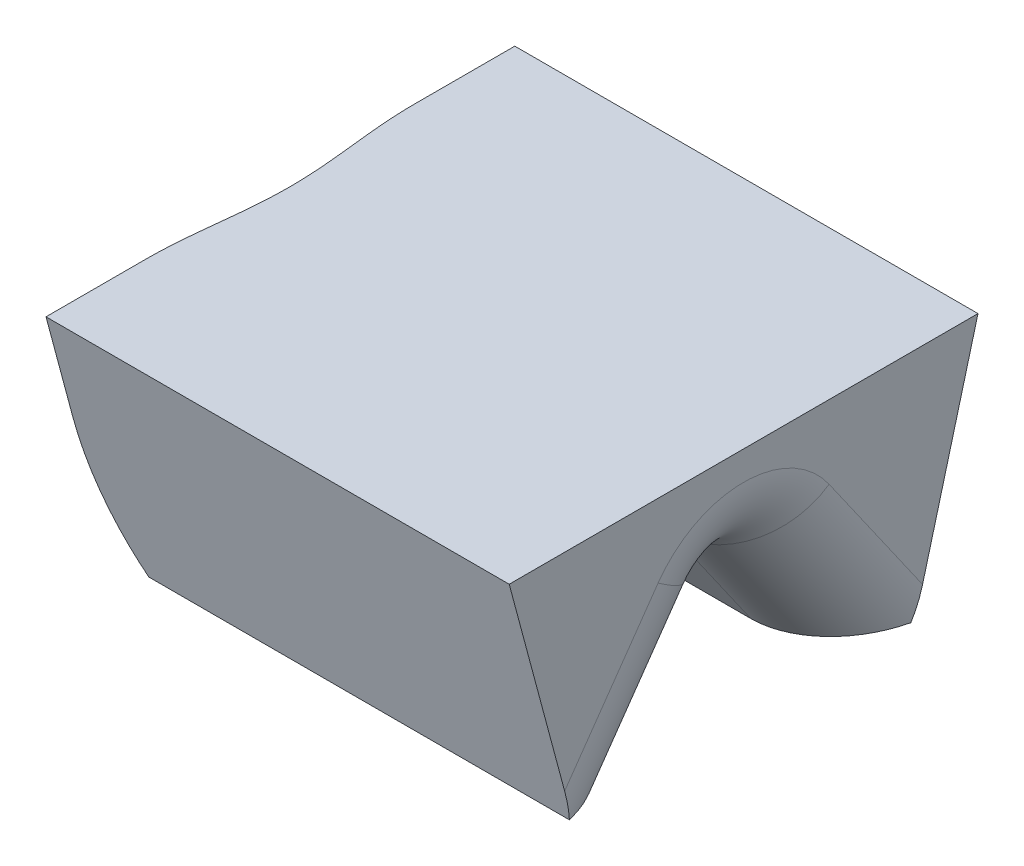
ISO-10303-21;
HEADER;
FILE_DESCRIPTION(('STEP AP214'),'2;1');
FILE_NAME('part.step','',(''),(''),'','','');
FILE_SCHEMA(('AUTOMOTIVE_DESIGN { 1 0 10303 214 1 1 1 1 }'));
ENDSEC;
DATA;
#1=APPLICATION_CONTEXT('core data for automotive mechanical design processes');
#2=APPLICATION_PROTOCOL_DEFINITION('international standard','automotive_design',2000,#1);
#3=PRODUCT_CONTEXT('',#1,'mechanical');
#4=PRODUCT('Part','Part','',(#3));
#5=PRODUCT_RELATED_PRODUCT_CATEGORY('part','',(#4));
#6=PRODUCT_DEFINITION_FORMATION('','',#4);
#7=PRODUCT_DEFINITION_CONTEXT('part definition',#1,'design');
#8=PRODUCT_DEFINITION('design','',#6,#7);
#9=PRODUCT_DEFINITION_SHAPE('','',#8);
#10=(LENGTH_UNIT() NAMED_UNIT(*) SI_UNIT(.MILLI.,.METRE.));
#11=(NAMED_UNIT(*) PLANE_ANGLE_UNIT() SI_UNIT($,.RADIAN.));
#12=(NAMED_UNIT(*) SI_UNIT($,.STERADIAN.) SOLID_ANGLE_UNIT());
#13=UNCERTAINTY_MEASURE_WITH_UNIT(LENGTH_MEASURE(1.E-05),#10,'distance_accuracy_value','');
#14=(GEOMETRIC_REPRESENTATION_CONTEXT(3) GLOBAL_UNCERTAINTY_ASSIGNED_CONTEXT((#13)) GLOBAL_UNIT_ASSIGNED_CONTEXT((#10,
#11,#12)) REPRESENTATION_CONTEXT('',''));
#15=CARTESIAN_POINT('',(0.,0.,0.));
#16=DIRECTION('',(0.,0.,1.));
#17=DIRECTION('',(1.,0.,0.));
#18=AXIS2_PLACEMENT_3D('',#15,#16,#17);
#19=CARTESIAN_POINT('',(0.,0.277595628415304,0.));
#20=DIRECTION('',(0.,1.,0.));
#21=DIRECTION('',(0.,0.,1.));
#22=AXIS2_PLACEMENT_3D('',#19,#20,#21);
#23=PLANE('',#22);
#24=DIRECTION('',(0.,0.,1.));
#25=VECTOR('',#24,1.);
#26=CARTESIAN_POINT('',(0.27178,0.277595628415304,1.50859998));
#27=LINE('',#26,#25);
#28=CARTESIAN_POINT('',(0.27178,0.277595628415304,-0.273771524456291));
#29=VERTEX_POINT('',#28);
#30=CARTESIAN_POINT('',(0.27178,0.277595628415304,0.273771524456291));
#31=VERTEX_POINT('',#30);
#32=EDGE_CURVE('E374',#29,#31,#27,.T.);
#33=ORIENTED_EDGE('',*,*,#32,.F.);
#34=DIRECTION('',(1.,0.,0.));
#35=VECTOR('',#34,1.);
#36=CARTESIAN_POINT('',(1.50859998,0.277595628415304,-0.273771524456291));
#37=LINE('',#36,#35);
#38=CARTESIAN_POINT('',(-0.26924,0.277595628415304,-0.273771524456291));
#39=VERTEX_POINT('',#38);
#40=EDGE_CURVE('E392',#39,#29,#37,.T.);
#41=ORIENTED_EDGE('',*,*,#40,.F.);
#42=DIRECTION('',(0.,0.,-1.));
#43=VECTOR('',#42,1.);
#44=CARTESIAN_POINT('',(-0.26924,0.277595628415304,1.50859998));
#45=LINE('',#44,#43);
#46=CARTESIAN_POINT('',(-0.26924,0.277595628415304,-0.156835133555911));
#47=VERTEX_POINT('',#46);
#48=EDGE_CURVE('E63',#47,#39,#45,.T.);
#49=ORIENTED_EDGE('',*,*,#48,.F.);
#50=CARTESIAN_POINT('',(-0.258316065764862,0.277595628415304,0.));
#51=CARTESIAN_POINT('',(-0.258319581723213,0.277595628415304,-0.0133573572333045));
#52=CARTESIAN_POINT('',(-0.258946636752462,0.277595628415304,-0.026714564460264));
#53=CARTESIAN_POINT('',(-0.261024215693477,0.277595628415304,-0.0533773420007175));
#54=CARTESIAN_POINT('',(-0.262476467960463,0.277595628415304,-0.0666827447303772));
#55=CARTESIAN_POINT('',(-0.265337387801582,0.277595628415304,-0.0933045480556776));
#56=CARTESIAN_POINT('',(-0.266746036769228,0.277595628415304,-0.106620950923157));
#57=CARTESIAN_POINT('',(-0.268744557554122,0.277595628415304,-0.133300755183635));
#58=CARTESIAN_POINT('',(-0.26933612574606,0.277595628415304,-0.146664001281597));
#59=CARTESIAN_POINT('',(-0.269110185577998,0.277595628415304,-0.174352881249858));
#60=CARTESIAN_POINT('',(-0.268189160155607,0.277595628415304,-0.188679171880719));
#61=CARTESIAN_POINT('',(-0.264233190056462,0.277595628415304,-0.217049988659772));
#62=CARTESIAN_POINT('',(-0.261199587941552,0.277595628415304,-0.231094687933217));
#63=CARTESIAN_POINT('',(-0.252679347439575,0.277595628415304,-0.258619114772984));
#64=CARTESIAN_POINT('',(-0.247164598402838,0.277595628415304,-0.272090375012309));
#65=CARTESIAN_POINT('',(-0.233598927454607,0.277595628415304,-0.29770338378269));
#66=CARTESIAN_POINT('',(-0.225549335107096,0.277595628415304,-0.309845824810772));
#67=CARTESIAN_POINT('',(-0.208294763642126,0.277595628415304,-0.330712750197026));
#68=CARTESIAN_POINT('',(-0.199378970562116,0.277595628415304,-0.339676587957936));
#69=CARTESIAN_POINT('',(-0.180003705320509,0.277595628415304,-0.355744079806716));
#70=CARTESIAN_POINT('',(-0.169545310358428,0.277595628415304,-0.362849022435234));
#71=CARTESIAN_POINT('',(-0.148695189983468,0.277595628415304,-0.37419383571117));
#72=CARTESIAN_POINT('',(-0.13842970537989,0.277595628415304,-0.378666863124576));
#73=CARTESIAN_POINT('',(-0.117271203993574,0.277595628415304,-0.385729341936798));
#74=CARTESIAN_POINT('',(-0.106378460966107,0.277595628415304,-0.388319608407823));
#75=CARTESIAN_POINT('',(-0.0848272233601214,0.277595628415304,-0.391443006274816));
#76=CARTESIAN_POINT('',(-0.0741818238760437,0.277595628415304,-0.392067199115077));
#77=CARTESIAN_POINT('',(-0.0529395294128856,0.277595628415304,-0.391495039694482));
#78=CARTESIAN_POINT('',(-0.0423426338463165,0.277595628415304,-0.39029870954299));
#79=CARTESIAN_POINT('',(-0.0216339993252356,0.277595628415304,-0.386153317625145));
#80=CARTESIAN_POINT('',(-0.0115179047356051,0.277595628415304,-0.383225927400932));
#81=CARTESIAN_POINT('',(0.00808537216412153,0.277595628415304,-0.375737330565397));
#82=CARTESIAN_POINT('',(0.0175727410201279,0.277595628415304,-0.371176611165897));
#83=CARTESIAN_POINT('',(0.035798799802488,0.277595628415304,-0.360500672800452));
#84=CARTESIAN_POINT('',(0.044525705609951,0.277595628415304,-0.354365373572935));
#85=CARTESIAN_POINT('',(0.0608846093571724,0.277595628415304,-0.340766624520734));
#86=CARTESIAN_POINT('',(0.0685155283507224,0.277595628415304,-0.333301881894461));
#87=CARTESIAN_POINT('',(0.0828253842906156,0.277595628415304,-0.316930985979422));
#88=CARTESIAN_POINT('',(0.0894488422774416,0.277595628415304,-0.307976439341334));
#89=CARTESIAN_POINT('',(0.101220640452154,0.277595628415304,-0.289174582103424));
#90=CARTESIAN_POINT('',(0.106371479314435,0.277595628415304,-0.279328821510869));
#91=CARTESIAN_POINT('',(0.115581341272987,0.277595628415304,-0.258113385825763));
#92=CARTESIAN_POINT('',(0.119506541384628,0.277595628415304,-0.246685638348774));
#93=CARTESIAN_POINT('',(0.124152471693822,0.277595628415304,-0.229210331485362));
#94=CARTESIAN_POINT('',(0.125495483126774,0.277595628415304,-0.223318241614892));
#95=CARTESIAN_POINT('',(0.127784886373686,0.277595628415304,-0.211470727028606));
#96=CARTESIAN_POINT('',(0.128732153740701,0.277595628415304,-0.205515472338883));
#97=CARTESIAN_POINT('',(0.131141922339676,0.277595628415304,-0.186646550189418));
#98=CARTESIAN_POINT('',(0.131934583532181,0.277595628415304,-0.173645482962802));
#99=CARTESIAN_POINT('',(0.132188706517757,0.277595628415304,-0.147627773005509));
#100=CARTESIAN_POINT('',(0.131647771661843,0.277595628415304,-0.134611144313768));
#101=CARTESIAN_POINT('',(0.129762813435293,0.277595628415304,-0.108567764176989));
#102=CARTESIAN_POINT('',(0.128413892971252,0.277595628415304,-0.0955414387701876));
#103=CARTESIAN_POINT('',(0.125624121643513,0.277595628415304,-0.0695123745452211));
#104=CARTESIAN_POINT('',(0.124183351899568,0.277595628415304,-0.056509625065205));
#105=CARTESIAN_POINT('',(0.122000296345347,0.277595628415304,-0.0301767827468526));
#106=CARTESIAN_POINT('',(0.121272102115061,0.277595628415304,-0.01684523286713));
#107=CARTESIAN_POINT('',(0.121067223608264,0.277595628415304,0.00982932926050934));
#108=CARTESIAN_POINT('',(0.121590480159715,0.277595628415304,0.0231723409366608));
#109=CARTESIAN_POINT('',(0.123519030248132,0.277595628415304,0.049766867355532));
#110=CARTESIAN_POINT('',(0.124923578205092,0.277595628415304,0.0630184498769465));
#111=CARTESIAN_POINT('',(0.127769068611856,0.277595628415304,0.0895196611906262));
#112=CARTESIAN_POINT('',(0.129210016265645,0.277595628415304,0.102769289428003));
#113=CARTESIAN_POINT('',(0.130994207165341,0.277595628415304,0.124892386517151));
#114=CARTESIAN_POINT('',(0.131543410028066,0.277595628415304,0.133746992245624));
#115=CARTESIAN_POINT('',(0.132131819722375,0.277595628415304,0.151467631104964));
#116=CARTESIAN_POINT('',(0.132171503347371,0.277595628415304,0.160333645786795));
#117=CARTESIAN_POINT('',(0.131593060334447,0.277595628415304,0.177970921843009));
#118=CARTESIAN_POINT('',(0.130980649016523,0.277595628415304,0.18674233692102));
#119=CARTESIAN_POINT('',(0.128992835127563,0.277595628415304,0.204201217873008));
#120=CARTESIAN_POINT('',(0.127617280994916,0.277595628415304,0.212888666722326));
#121=CARTESIAN_POINT('',(0.123176733195247,0.277595628415304,0.234090938450728));
#122=CARTESIAN_POINT('',(0.119623839956292,0.277595628415304,0.246509739036082));
#123=CARTESIAN_POINT('',(0.110511877578375,0.277595628415304,0.270678220537578));
#124=CARTESIAN_POINT('',(0.104941716118858,0.277595628415304,0.282423777604592));
#125=CARTESIAN_POINT('',(0.0917600333763843,0.277595628415304,0.304798235140745));
#126=CARTESIAN_POINT('',(0.0841385849496845,0.277595628415304,0.315421345873207));
#127=CARTESIAN_POINT('',(0.0670325906383239,0.277595628415304,0.335005639016105));
#128=CARTESIAN_POINT('',(0.0575532375646795,0.277595628415304,0.343971321202508));
#129=CARTESIAN_POINT('',(0.0381274235305449,0.277595628415304,0.358995203585384));
#130=CARTESIAN_POINT('',(0.0283428155801989,0.277595628415304,0.365263158339736));
#131=CARTESIAN_POINT('',(0.00779519835325502,0.277595628415304,0.375932551128299));
#132=CARTESIAN_POINT('',(-0.00296806625771167,0.277595628415304,0.380333500348691));
#133=CARTESIAN_POINT('',(-0.0243653296924094,0.277595628415304,0.386855613361861));
#134=CARTESIAN_POINT('',(-0.034958544283781,0.277595628415304,0.389111206490908));
#135=CARTESIAN_POINT('',(-0.0563724590207713,0.277595628415304,0.391760537790259));
#136=CARTESIAN_POINT('',(-0.0671930618700635,0.277595628415304,0.392155056627043));
#137=CARTESIAN_POINT('',(-0.0884665606862955,0.277595628415304,0.391083332907498));
#138=CARTESIAN_POINT('',(-0.0989218477844755,0.277595628415304,0.389663767915564));
#139=CARTESIAN_POINT('',(-0.119446716267812,0.277595628415304,0.385093066388629));
#140=CARTESIAN_POINT('',(-0.129516282455157,0.277595628415304,0.381941861700107));
#141=CARTESIAN_POINT('',(-0.14901806603541,0.277595628415304,0.374004788608507));
#142=CARTESIAN_POINT('',(-0.158448565238266,0.277595628415304,0.36921470777855));
#143=CARTESIAN_POINT('',(-0.176399712426924,0.277595628415304,0.358162163791041));
#144=CARTESIAN_POINT('',(-0.184920394498652,0.277595628415304,0.351899755821789));
#145=CARTESIAN_POINT('',(-0.201088485348223,0.277595628415304,0.337901287972741));
#146=CARTESIAN_POINT('',(-0.208703358071232,0.277595628415304,0.330127722154216));
#147=CARTESIAN_POINT('',(-0.222614296991539,0.277595628415304,0.313477933230045));
#148=CARTESIAN_POINT('',(-0.228909698085481,0.277595628415304,0.304601157605575));
#149=CARTESIAN_POINT('',(-0.240459835240113,0.277595628415304,0.285401795583443));
#150=CARTESIAN_POINT('',(-0.245620417372384,0.277595628415304,0.275022749599116));
#151=CARTESIAN_POINT('',(-0.254337737156891,0.277595628415304,0.253631953146645));
#152=CARTESIAN_POINT('',(-0.257895741305191,0.277595628415304,0.242620710082681));
#153=CARTESIAN_POINT('',(-0.264904990374676,0.277595628415304,0.214587978479131));
#154=CARTESIAN_POINT('',(-0.267403232641209,0.277595628415304,0.19732803733479));
#155=CARTESIAN_POINT('',(-0.269638473447273,0.277595628415304,0.162598992446642));
#156=CARTESIAN_POINT('',(-0.269360534552631,0.277595628415304,0.145129262905894));
#157=CARTESIAN_POINT('',(-0.267614796576648,0.277595628415304,0.11703218040305));
#158=CARTESIAN_POINT('',(-0.266646599901579,0.277595628415304,0.106361417430718));
#159=CARTESIAN_POINT('',(-0.26447766108076,0.277595628415304,0.0850350787463591));
#160=CARTESIAN_POINT('',(-0.263276720445326,0.277595628415304,0.0743795238737971));
#161=CARTESIAN_POINT('',(-0.261083665173924,0.277595628415304,0.0531157808921605));
#162=CARTESIAN_POINT('',(-0.260090224338683,0.277595628415304,0.0425077444444405));
#163=CARTESIAN_POINT('',(-0.25870560338014,0.277595628415304,0.0212663815979185));
#164=CARTESIAN_POINT('',(-0.258313266881203,0.277595628415304,0.0106331432696084));
#165=CARTESIAN_POINT('',(-0.258316065764862,0.277595628415304,0.));
#166=B_SPLINE_CURVE_WITH_KNOTS('',3,(#50,#51,#52,#53,#54,#55,#56,#57,#58,#59,#60,#61,#62,#63,
#64,#65,#66,#67,#68,#69,#70,#71,#72,#73,#74,#75,#76,#77,#78,#79,#80,#81,#82,#83,#84,#85,#86,#87,
#88,#89,#90,#91,#92,#93,#94,#95,#96,#97,#98,#99,#100,#101,#102,#103,#104,#105,#106,#107,#108,
#109,#110,#111,#112,#113,#114,#115,#116,#117,#118,#119,#120,#121,#122,#123,#124,#125,#126,#127,
#128,#129,#130,#131,#132,#133,#134,#135,#136,#137,#138,#139,#140,#141,#142,#143,#144,#145,#146,
#147,#148,#149,#150,#151,#152,#153,#154,#155,#156,#157,#158,#159,#160,#161,#162,#163,#164,#165),
.UNSPECIFIED.,.T.,.F.,(4,2,2,2,2,2,2,2,2,2,2,2,2,2,2,2,2,2,2,2,2,2,2,2,2,2,2,2,2,2,2,2,2,2,2,2,
2,2,2,2,2,2,2,2,2,2,2,2,2,2,2,2,2,2,2,2,2,4),(0.,0.0400667012763012,0.0802176322385873,
0.120385466682642,0.160469781055812,0.203413249220812,0.246329451293781,0.289744627455173,
0.333137069518122,0.370849205869476,0.408535131413483,0.441958755407641,0.475367901239217,
0.50720501192803,0.539041735973751,0.570488083988754,0.601925059558243,0.633784802903578,
0.665675698750745,0.698946501415674,0.732160512010009,0.768261606841802,0.78638029058175,
0.804458673091193,0.843431162986537,0.882473742653211,0.921755383108164,0.961002798826581,
1.00101154904342,1.04101840757381,1.08099146551355,1.12097027102341,1.14757452519485,
1.17415388205592,1.20050218561122,1.22685572386381,1.26544694824528,1.30425367813766,
1.34325169828868,1.38214223528141,1.41681964750779,1.45150613327586,1.48383901309019,
1.51615832899608,1.54766255008455,1.57916801119853,1.61075506729956,1.64234093958893,
1.67484384681284,1.70736309851601,1.74199457306809,1.77659863059832,1.82860003769383,
1.88088139202055,1.91302292764384,1.945191995938,1.97714870493006,2.00904385960551),.UNSPECIFIED.);
#167=CARTESIAN_POINT('',(-0.269240000000016,0.277595628415304,0.15683513355591));
#168=VERTEX_POINT('',#167);
#169=EDGE_CURVE('E12',#168,#47,#166,.T.);
#170=ORIENTED_EDGE('',*,*,#169,.F.);
#171=CARTESIAN_POINT('',(-0.26924,0.277595628415304,0.273771524456291));
#172=VERTEX_POINT('',#171);
#173=EDGE_CURVE('E141',#172,#168,#45,.T.);
#174=ORIENTED_EDGE('',*,*,#173,.F.);
#175=DIRECTION('',(-1.,0.,0.));
#176=VECTOR('',#175,1.);
#177=CARTESIAN_POINT('',(1.50859998,0.277595628415304,0.273771524456291));
#178=LINE('',#177,#176);
#179=EDGE_CURVE('E154',#31,#172,#178,.T.);
#180=ORIENTED_EDGE('',*,*,#179,.F.);
#181=EDGE_LOOP('',(#33,#41,#49,#170,#174,#180));
#182=FACE_BOUND('',#181,.T.);
#183=ADVANCED_FACE('F43',(#182),#23,.T.);
#184=CARTESIAN_POINT('',(1.50859998,0.,-0.19939));
#185=DIRECTION('',(0.,-0.258819045102522,-0.965925826289068));
#186=DIRECTION('',(0.,0.965925826289068,-0.258819045102522));
#187=AXIS2_PLACEMENT_3D('',#184,#185,#186);
#188=PLANE('',#187);
#189=DIRECTION('',(0.,0.965925826289068,-0.258819045102522));
#190=VECTOR('',#189,1.);
#191=CARTESIAN_POINT('',(-0.26924,0.,-0.19939));
#192=LINE('',#191,#190);
#193=CARTESIAN_POINT('',(-0.26924,0.160868655615237,-0.242494626359583));
#194=VERTEX_POINT('',#193);
#195=EDGE_CURVE('E299',#194,#39,#192,.T.);
#196=ORIENTED_EDGE('',*,*,#195,.T.);
#197=ORIENTED_EDGE('',*,*,#40,.T.);
#198=DIRECTION('',(0.,-0.965925826289068,0.258819045102522));
#199=VECTOR('',#198,1.);
#200=CARTESIAN_POINT('',(0.27178,0.,-0.19939));
#201=LINE('',#200,#199);
#202=CARTESIAN_POINT('',(0.27178,0.035961265173748,-0.209025791962107));
#203=VERTEX_POINT('',#202);
#204=EDGE_CURVE('E296',#29,#203,#201,.T.);
#205=ORIENTED_EDGE('',*,*,#204,.T.);
#206=CARTESIAN_POINT('',(0.17018,0.035961265173748,-0.209025791962107));
#207=DIRECTION('',(0.,-0.258819045102522,-0.965925826289068));
#208=DIRECTION('',(0.,-0.965925826289068,0.258819045102522));
#209=AXIS2_PLACEMENT_3D('',#206,#207,#208);
#210=ELLIPSE('',#209,0.13262938059616,0.1016);
#211=CARTESIAN_POINT('',(0.267695055093439,0.,-0.19939));
#212=VERTEX_POINT('',#211);
#213=EDGE_CURVE('E348',#203,#212,#210,.T.);
#214=ORIENTED_EDGE('',*,*,#213,.T.);
#215=DIRECTION('',(-1.,0.,0.));
#216=VECTOR('',#215,1.);
#217=CARTESIAN_POINT('',(1.50859998,0.,-0.19939));
#218=LINE('',#217,#216);
#219=CARTESIAN_POINT('',(-0.223460122767598,0.,-0.19939));
#220=VERTEX_POINT('',#219);
#221=EDGE_CURVE('E306',#212,#220,#218,.T.);
#222=ORIENTED_EDGE('',*,*,#221,.T.);
#223=CARTESIAN_POINT('',(-0.0685799999999999,0.160868655615237,-0.242494626359583));
#224=DIRECTION('',(0.,-0.258819045102522,-0.965925826289068));
#225=DIRECTION('',(0.,0.965925826289068,-0.258819045102522));
#226=AXIS2_PLACEMENT_3D('',#223,#224,#225);
#227=ELLIPSE('',#226,0.261943026677416,0.20066);
#228=EDGE_CURVE('E198',#220,#194,#227,.T.);
#229=ORIENTED_EDGE('',*,*,#228,.T.);
#230=EDGE_LOOP('',(#196,#197,#205,#214,#222,#229));
#231=FACE_BOUND('',#230,.T.);
#232=ADVANCED_FACE('F240',(#231),#188,.T.);
#233=CARTESIAN_POINT('',(1.50859998,0.,0.19939));
#234=DIRECTION('',(0.,-0.258819045102522,0.965925826289068));
#235=DIRECTION('',(0.,-0.965925826289068,-0.258819045102522));
#236=AXIS2_PLACEMENT_3D('',#233,#234,#235);
#237=PLANE('',#236);
#238=DIRECTION('',(0.,0.965925826289068,0.258819045102522));
#239=VECTOR('',#238,1.);
#240=CARTESIAN_POINT('',(0.27178,0.,0.19939));
#241=LINE('',#240,#239);
#242=CARTESIAN_POINT('',(0.27178,0.035961265173748,0.209025791962107));
#243=VERTEX_POINT('',#242);
#244=EDGE_CURVE('E287',#243,#31,#241,.T.);
#245=ORIENTED_EDGE('',*,*,#244,.T.);
#246=ORIENTED_EDGE('',*,*,#179,.T.);
#247=DIRECTION('',(0.,-0.965925826289068,-0.258819045102522));
#248=VECTOR('',#247,1.);
#249=CARTESIAN_POINT('',(-0.26924,0.,0.19939));
#250=LINE('',#249,#248);
#251=CARTESIAN_POINT('',(-0.26924,0.160868655615237,0.242494626359583));
#252=VERTEX_POINT('',#251);
#253=EDGE_CURVE('E153',#172,#252,#250,.T.);
#254=ORIENTED_EDGE('',*,*,#253,.T.);
#255=CARTESIAN_POINT('',(-0.06858,0.160868655615237,0.242494626359583));
#256=DIRECTION('',(0.,-0.258819045102522,0.965925826289068));
#257=DIRECTION('',(0.,-0.965925826289068,-0.258819045102522));
#258=AXIS2_PLACEMENT_3D('',#255,#256,#257);
#259=ELLIPSE('',#258,0.261943026677416,0.20066);
#260=CARTESIAN_POINT('',(-0.223460122767598,0.,0.19939));
#261=VERTEX_POINT('',#260);
#262=EDGE_CURVE('E176',#252,#261,#259,.T.);
#263=ORIENTED_EDGE('',*,*,#262,.T.);
#264=DIRECTION('',(-1.,0.,0.));
#265=VECTOR('',#264,1.);
#266=CARTESIAN_POINT('',(1.50859998,0.,0.19939));
#267=LINE('',#266,#265);
#268=CARTESIAN_POINT('',(0.267695055093439,0.,0.19939));
#269=VERTEX_POINT('',#268);
#270=EDGE_CURVE('E303',#269,#261,#267,.T.);
#271=ORIENTED_EDGE('',*,*,#270,.F.);
#272=CARTESIAN_POINT('',(0.17018,0.035961265173748,0.209025791962107));
#273=DIRECTION('',(0.,-0.258819045102522,0.965925826289068));
#274=DIRECTION('',(0.,0.965925826289068,0.258819045102522));
#275=AXIS2_PLACEMENT_3D('',#272,#273,#274);
#276=ELLIPSE('',#275,0.13262938059616,0.1016);
#277=EDGE_CURVE('E365',#269,#243,#276,.T.);
#278=ORIENTED_EDGE('',*,*,#277,.T.);
#279=EDGE_LOOP('',(#245,#246,#254,#263,#271,#278));
#280=FACE_BOUND('',#279,.T.);
#281=ADVANCED_FACE('F270',(#280),#237,.T.);
#282=CARTESIAN_POINT('',(-0.26924,0.82312002,1.50859998));
#283=DIRECTION('',(-1.,0.,0.));
#284=DIRECTION('',(0.,-1.,0.));
#285=AXIS2_PLACEMENT_3D('',#282,#283,#284);
#286=PLANE('',#285);
#287=ORIENTED_EDGE('',*,*,#253,.F.);
#288=ORIENTED_EDGE('',*,*,#173,.T.);
#289=CARTESIAN_POINT('',(-0.26924,0.12192,0.));
#290=DIRECTION('',(-1.,0.,0.));
#291=DIRECTION('',(0.,-1.,0.));
#292=AXIS2_PLACEMENT_3D('',#289,#290,#291);
#293=CIRCLE('',#292,0.22098);
#294=CARTESIAN_POINT('',(-0.26924,0.248668920904854,0.181016218746982));
#295=VERTEX_POINT('',#294);
#296=EDGE_CURVE('E151',#168,#295,#293,.F.);
#297=ORIENTED_EDGE('',*,*,#296,.T.);
#298=DIRECTION('',(0.,0.819152044288994,-0.573576436351044));
#299=VECTOR('',#298,1.);
#300=CARTESIAN_POINT('',(-0.26924,0.1150938477182,0.27454649190919));
#301=LINE('',#300,#299);
#302=EDGE_CURVE('E168',#295,#252,#301,.F.);
#303=ORIENTED_EDGE('',*,*,#302,.T.);
#304=EDGE_LOOP('',(#287,#288,#297,#303));
#305=FACE_BOUND('',#304,.T.);
#306=ADVANCED_FACE('F149',(#305),#286,.T.);
#307=CARTESIAN_POINT('',(-0.26924,0.248668920904854,-0.181016218746982));
#308=VERTEX_POINT('',#307);
#309=EDGE_CURVE('E161',#308,#47,#293,.F.);
#310=ORIENTED_EDGE('',*,*,#309,.T.);
#311=ORIENTED_EDGE('',*,*,#48,.T.);
#312=ORIENTED_EDGE('',*,*,#195,.F.);
#313=DIRECTION('',(0.,-0.819152044288993,-0.573576436351044));
#314=VECTOR('',#313,1.);
#315=CARTESIAN_POINT('',(-0.26924,0.248668920904854,-0.181016218746982));
#316=LINE('',#315,#314);
#317=EDGE_CURVE('E162',#194,#308,#316,.F.);
#318=ORIENTED_EDGE('',*,*,#317,.T.);
#319=EDGE_LOOP('',(#310,#311,#312,#318));
#320=FACE_BOUND('',#319,.T.);
#321=ADVANCED_FACE('F399',(#320),#286,.T.);
#322=CARTESIAN_POINT('',(0.27178,-0.00999998,1.50859998));
#323=DIRECTION('',(1.,0.,0.));
#324=DIRECTION('',(0.,0.,-1.));
#325=AXIS2_PLACEMENT_3D('',#322,#323,#324);
#326=PLANE('',#325);
#327=ORIENTED_EDGE('',*,*,#204,.F.);
#328=ORIENTED_EDGE('',*,*,#32,.T.);
#329=ORIENTED_EDGE('',*,*,#244,.F.);
#330=DIRECTION('',(0.,-0.819152044288994,0.573576436351044));
#331=VECTOR('',#330,1.);
#332=CARTESIAN_POINT('',(0.27178,0.191850439119919,0.0998710172397142));
#333=LINE('',#332,#331);
#334=CARTESIAN_POINT('',(0.27178,0.191850439119919,0.0998710172397142));
#335=VERTEX_POINT('',#334);
#336=EDGE_CURVE('E385',#243,#335,#333,.F.);
#337=ORIENTED_EDGE('',*,*,#336,.T.);
#338=CARTESIAN_POINT('',(0.27178,0.12192,0.));
#339=DIRECTION('',(1.,0.,0.));
#340=DIRECTION('',(0.,0.,-1.));
#341=AXIS2_PLACEMENT_3D('',#338,#339,#340);
#342=CIRCLE('',#341,0.12192);
#343=CARTESIAN_POINT('',(0.27178,0.191850439119919,-0.0998710172397142));
#344=VERTEX_POINT('',#343);
#345=EDGE_CURVE('E382',#335,#344,#342,.F.);
#346=ORIENTED_EDGE('',*,*,#345,.T.);
#347=DIRECTION('',(0.,0.819152044288993,0.573576436351044));
#348=VECTOR('',#347,1.);
#349=CARTESIAN_POINT('',(0.27178,0.058275365933266,-0.193401290401922));
#350=LINE('',#349,#348);
#351=EDGE_CURVE('E355',#344,#203,#350,.F.);
#352=ORIENTED_EDGE('',*,*,#351,.T.);
#353=EDGE_LOOP('',(#327,#328,#329,#337,#346,#352));
#354=FACE_BOUND('',#353,.T.);
#355=ADVANCED_FACE('F250',(#354),#326,.T.);
#356=CARTESIAN_POINT('',(-0.0685799999999999,0.12192,0.));
#357=DIRECTION('',(-1.,0.,0.));
#358=DIRECTION('',(0.,-1.,0.));
#359=AXIS2_PLACEMENT_3D('',#356,#357,#358);
#360=TOROIDAL_SURFACE('',#359,0.22098,0.20066);
#361=ORIENTED_EDGE('',*,*,#296,.F.);
#362=ORIENTED_EDGE('',*,*,#169,.T.);
#363=ORIENTED_EDGE('',*,*,#309,.F.);
#364=CARTESIAN_POINT('',(-0.0685799999999999,0.248668920904854,-0.181016218746982));
#365=DIRECTION('',(0.,0.819152044288993,0.573576436351045));
#366=DIRECTION('',(0.,-0.573576436351045,0.819152044288993));
#367=AXIS2_PLACEMENT_3D('',#364,#365,#366);
#368=CIRCLE('',#367,0.20066);
#369=CARTESIAN_POINT('',(-0.0685799999999999,0.133575073186653,-0.0166451695399524));
#370=VERTEX_POINT('',#369);
#371=EDGE_CURVE('E206',#308,#370,#368,.T.);
#372=ORIENTED_EDGE('',*,*,#371,.T.);
#373=CARTESIAN_POINT('',(-0.0685799999999999,0.12192,0.));
#374=DIRECTION('',(-1.,0.,0.));
#375=DIRECTION('',(0.,-1.,0.));
#376=AXIS2_PLACEMENT_3D('',#373,#374,#375);
#377=CIRCLE('',#376,0.0203200000000001);
#378=CARTESIAN_POINT('',(-0.0685799999999999,0.133575073186653,0.0166451695399524));
#379=VERTEX_POINT('',#378);
#380=EDGE_CURVE('E183',#379,#370,#377,.T.);
#381=ORIENTED_EDGE('',*,*,#380,.F.);
#382=CARTESIAN_POINT('',(-0.0685799999999999,0.248668920904854,0.181016218746982));
#383=DIRECTION('',(0.,-0.819152044288993,0.573576436351044));
#384=DIRECTION('',(0.,-0.573576436351044,-0.819152044288993));
#385=AXIS2_PLACEMENT_3D('',#382,#383,#384);
#386=CIRCLE('',#385,0.20066);
#387=EDGE_CURVE('E159',#295,#379,#386,.T.);
#388=ORIENTED_EDGE('',*,*,#387,.F.);
#389=EDGE_LOOP('',(#361,#362,#363,#372,#381,#388));
#390=FACE_BOUND('',#389,.T.);
#391=ADVANCED_FACE('F157',(#390),#360,.T.);
#392=CARTESIAN_POINT('',(0.,0.,0.));
#393=DIRECTION('',(0.,1.,0.));
#394=DIRECTION('',(0.,0.,1.));
#395=AXIS2_PLACEMENT_3D('',#392,#393,#394);
#396=PLANE('',#395);
#397=ORIENTED_EDGE('',*,*,#221,.F.);
#398=CARTESIAN_POINT('',(0.17018,0.,-0.234206140920324));
#399=DIRECTION('',(0.,1.,0.));
#400=DIRECTION('',(0.,0.,-1.));
#401=AXIS2_PLACEMENT_3D('',#398,#399,#400);
#402=ELLIPSE('',#401,0.124030698218164,0.1016);
#403=CARTESIAN_POINT('',(0.17018,0.,-0.11017544270216));
#404=VERTEX_POINT('',#403);
#405=EDGE_CURVE('E345',#212,#404,#402,.F.);
#406=ORIENTED_EDGE('',*,*,#405,.T.);
#407=CARTESIAN_POINT('',(0.17018,0.,-0.11017544270216));
#408=DIRECTION('',(-1.,0.,0.));
#409=VECTOR('',#408,1.);
#410=LINE('',#407,#409);
#411=CARTESIAN_POINT('',(-0.0685799999999998,0.,-0.11017544270216));
#412=VERTEX_POINT('',#411);
#413=EDGE_CURVE('E216',#404,#412,#410,.T.);
#414=ORIENTED_EDGE('',*,*,#413,.T.);
#415=CARTESIAN_POINT('',(-0.0685799999999999,0.,-0.355136071683033));
#416=DIRECTION('',(0.,1.,0.));
#417=DIRECTION('',(0.,0.,1.));
#418=AXIS2_PLACEMENT_3D('',#415,#416,#417);
#419=ELLIPSE('',#418,0.244960628980873,0.20066);
#420=EDGE_CURVE('E192',#412,#220,#419,.F.);
#421=ORIENTED_EDGE('',*,*,#420,.T.);
#422=EDGE_LOOP('',(#397,#406,#414,#421));
#423=FACE_BOUND('',#422,.T.);
#424=ADVANCED_FACE('F239',(#423),#396,.F.);
#425=CARTESIAN_POINT('',(-0.06858,0.,0.11017544270216));
#426=DIRECTION('',(1.,0.,0.));
#427=VECTOR('',#426,1.);
#428=LINE('',#425,#427);
#429=CARTESIAN_POINT('',(-0.0685799999999999,0.,0.11017544270216));
#430=VERTEX_POINT('',#429);
#431=CARTESIAN_POINT('',(0.17018,0.,0.11017544270216));
#432=VERTEX_POINT('',#431);
#433=EDGE_CURVE('E309',#430,#432,#428,.T.);
#434=ORIENTED_EDGE('',*,*,#433,.T.);
#435=CARTESIAN_POINT('',(0.17018,0.,0.234206140920324));
#436=DIRECTION('',(0.,1.,0.));
#437=DIRECTION('',(0.,0.,-1.));
#438=AXIS2_PLACEMENT_3D('',#435,#436,#437);
#439=ELLIPSE('',#438,0.124030698218164,0.1016);
#440=EDGE_CURVE('E70',#432,#269,#439,.F.);
#441=ORIENTED_EDGE('',*,*,#440,.T.);
#442=ORIENTED_EDGE('',*,*,#270,.T.);
#443=CARTESIAN_POINT('',(-0.0685799999999999,0.,0.355136071683033));
#444=DIRECTION('',(0.,1.,0.));
#445=DIRECTION('',(0.,0.,1.));
#446=AXIS2_PLACEMENT_3D('',#443,#444,#445);
#447=ELLIPSE('',#446,0.244960628980873,0.20066);
#448=EDGE_CURVE('E180',#261,#430,#447,.F.);
#449=ORIENTED_EDGE('',*,*,#448,.T.);
#450=EDGE_LOOP('',(#434,#441,#442,#449));
#451=FACE_BOUND('',#450,.T.);
#452=ADVANCED_FACE('F228',(#451),#396,.F.);
#453=CARTESIAN_POINT('',(-1.20142,0.133575073186653,-0.0166451695399524));
#454=DIRECTION('',(0.,0.573576436351044,-0.819152044288993));
#455=DIRECTION('',(0.,0.819152044288993,0.573576436351044));
#456=AXIS2_PLACEMENT_3D('',#453,#454,#455);
#457=PLANE('',#456);
#458=ORIENTED_EDGE('',*,*,#413,.F.);
#459=DIRECTION('',(0.,0.819152044288993,0.573576436351044));
#460=VECTOR('',#459,1.);
#461=CARTESIAN_POINT('',(0.17018,0.133575073186653,-0.0166451695399524));
#462=LINE('',#461,#460);
#463=CARTESIAN_POINT('',(0.17018,0.133575073186653,-0.0166451695399524));
#464=VERTEX_POINT('',#463);
#465=EDGE_CURVE('E203',#404,#464,#462,.T.);
#466=ORIENTED_EDGE('',*,*,#465,.T.);
#467=DIRECTION('',(1.,0.,0.));
#468=VECTOR('',#467,1.);
#469=CARTESIAN_POINT('',(-1.20142,0.133575073186653,-0.0166451695399524));
#470=LINE('',#469,#468);
#471=EDGE_CURVE('E211',#370,#464,#470,.T.);
#472=ORIENTED_EDGE('',*,*,#471,.F.);
#473=DIRECTION('',(0.,-0.819152044288993,-0.573576436351044));
#474=VECTOR('',#473,1.);
#475=CARTESIAN_POINT('',(-0.0685799999999999,0.,-0.11017544270216));
#476=LINE('',#475,#474);
#477=EDGE_CURVE('E188',#370,#412,#476,.T.);
#478=ORIENTED_EDGE('',*,*,#477,.T.);
#479=EDGE_LOOP('',(#458,#466,#472,#478));
#480=FACE_BOUND('',#479,.T.);
#481=ADVANCED_FACE('F238',(#480),#457,.F.);
#482=CARTESIAN_POINT('',(-1.20142,-0.00999998000000012,0.117177504080106));
#483=DIRECTION('',(0.,0.573576436351044,0.819152044288994));
#484=DIRECTION('',(0.,-0.819152044288994,0.573576436351044));
#485=AXIS2_PLACEMENT_3D('',#482,#483,#484);
#486=PLANE('',#485);
#487=DIRECTION('',(1.,0.,0.));
#488=VECTOR('',#487,1.);
#489=CARTESIAN_POINT('',(-1.20142,0.133575073186653,0.0166451695399524));
#490=LINE('',#489,#488);
#491=CARTESIAN_POINT('',(0.17018,0.133575073186653,0.0166451695399524));
#492=VERTEX_POINT('',#491);
#493=EDGE_CURVE('E297',#379,#492,#490,.T.);
#494=ORIENTED_EDGE('',*,*,#493,.T.);
#495=DIRECTION('',(0.,-0.819152044288994,0.573576436351044));
#496=VECTOR('',#495,1.);
#497=CARTESIAN_POINT('',(0.17018,0.,0.11017544270216));
#498=LINE('',#497,#496);
#499=EDGE_CURVE('E328',#492,#432,#498,.T.);
#500=ORIENTED_EDGE('',*,*,#499,.T.);
#501=ORIENTED_EDGE('',*,*,#433,.F.);
#502=DIRECTION('',(0.,0.819152044288994,-0.573576436351044));
#503=VECTOR('',#502,1.);
#504=CARTESIAN_POINT('',(-0.06858,0.133575073186653,0.0166451695399524));
#505=LINE('',#504,#503);
#506=EDGE_CURVE('E170',#430,#379,#505,.T.);
#507=ORIENTED_EDGE('',*,*,#506,.T.);
#508=EDGE_LOOP('',(#494,#500,#501,#507));
#509=FACE_BOUND('',#508,.T.);
#510=ADVANCED_FACE('F277',(#509),#486,.F.);
#511=CARTESIAN_POINT('',(-1.20142,0.12192,0.));
#512=DIRECTION('',(1.,0.,0.));
#513=DIRECTION('',(0.,0.,-1.));
#514=AXIS2_PLACEMENT_3D('',#511,#512,#513);
#515=CYLINDRICAL_SURFACE('',#514,0.0203200000000001);
#516=ORIENTED_EDGE('',*,*,#471,.T.);
#517=CARTESIAN_POINT('',(0.17018,0.12192,0.));
#518=DIRECTION('',(1.,0.,0.));
#519=DIRECTION('',(0.,0.,-1.));
#520=AXIS2_PLACEMENT_3D('',#517,#518,#519);
#521=CIRCLE('',#520,0.0203200000000001);
#522=EDGE_CURVE('E56',#464,#492,#521,.T.);
#523=ORIENTED_EDGE('',*,*,#522,.T.);
#524=ORIENTED_EDGE('',*,*,#493,.F.);
#525=ORIENTED_EDGE('',*,*,#380,.T.);
#526=EDGE_LOOP('',(#516,#523,#524,#525));
#527=FACE_BOUND('',#526,.T.);
#528=ADVANCED_FACE('F253',(#527),#515,.F.);
#529=CARTESIAN_POINT('',(-0.0685799999999999,0.248668920904854,-0.181016218746982));
#530=DIRECTION('',(0.,0.819152044288993,0.573576436351044));
#531=DIRECTION('',(0.,-0.573576436351044,0.819152044288993));
#532=AXIS2_PLACEMENT_3D('',#529,#530,#531);
#533=CYLINDRICAL_SURFACE('',#532,0.20066);
#534=ORIENTED_EDGE('',*,*,#420,.F.);
#535=ORIENTED_EDGE('',*,*,#477,.F.);
#536=ORIENTED_EDGE('',*,*,#371,.F.);
#537=ORIENTED_EDGE('',*,*,#317,.F.);
#538=ORIENTED_EDGE('',*,*,#228,.F.);
#539=EDGE_LOOP('',(#534,#535,#536,#537,#538));
#540=FACE_BOUND('',#539,.T.);
#541=ADVANCED_FACE('F245',(#540),#533,.T.);
#542=CARTESIAN_POINT('',(-0.0685799999999999,0.1050938677182,0.281548553287136));
#543=DIRECTION('',(0.,-0.819152044288994,0.573576436351044));
#544=DIRECTION('',(0.,-0.573576436351044,-0.819152044288994));
#545=AXIS2_PLACEMENT_3D('',#542,#543,#544);
#546=CYLINDRICAL_SURFACE('',#545,0.20066);
#547=ORIENTED_EDGE('',*,*,#262,.F.);
#548=ORIENTED_EDGE('',*,*,#302,.F.);
#549=ORIENTED_EDGE('',*,*,#387,.T.);
#550=ORIENTED_EDGE('',*,*,#506,.F.);
#551=ORIENTED_EDGE('',*,*,#448,.F.);
#552=EDGE_LOOP('',(#547,#548,#549,#550,#551));
#553=FACE_BOUND('',#552,.T.);
#554=ADVANCED_FACE('F242',(#553),#546,.T.);
#555=CARTESIAN_POINT('',(0.17018,0.0482753859332659,0.200403351779868));
#556=DIRECTION('',(0.,0.819152044288994,-0.573576436351044));
#557=DIRECTION('',(0.,0.573576436351044,0.819152044288994));
#558=AXIS2_PLACEMENT_3D('',#555,#556,#557);
#559=CYLINDRICAL_SURFACE('',#558,0.1016);
#560=ORIENTED_EDGE('',*,*,#440,.F.);
#561=ORIENTED_EDGE('',*,*,#499,.F.);
#562=CARTESIAN_POINT('',(0.17018,0.191850439119919,0.0998710172397142));
#563=DIRECTION('',(0.,0.819152044288994,-0.573576436351043));
#564=DIRECTION('',(0.,0.573576436351043,0.819152044288994));
#565=AXIS2_PLACEMENT_3D('',#562,#563,#564);
#566=CIRCLE('',#565,0.1016);
#567=EDGE_CURVE('E207',#335,#492,#566,.T.);
#568=ORIENTED_EDGE('',*,*,#567,.F.);
#569=ORIENTED_EDGE('',*,*,#336,.F.);
#570=ORIENTED_EDGE('',*,*,#277,.F.);
#571=EDGE_LOOP('',(#560,#561,#568,#569,#570));
#572=FACE_BOUND('',#571,.T.);
#573=ADVANCED_FACE('F45',(#572),#559,.T.);
#574=CARTESIAN_POINT('',(0.17018,0.12192,0.));
#575=DIRECTION('',(1.,0.,0.));
#576=DIRECTION('',(0.,0.,-1.));
#577=AXIS2_PLACEMENT_3D('',#574,#575,#576);
#578=TOROIDAL_SURFACE('',#577,0.12192,0.1016);
#579=ORIENTED_EDGE('',*,*,#567,.T.);
#580=ORIENTED_EDGE('',*,*,#522,.F.);
#581=CARTESIAN_POINT('',(0.17018,0.191850439119919,-0.0998710172397142));
#582=DIRECTION('',(0.,-0.819152044288993,-0.573576436351044));
#583=DIRECTION('',(0.,0.573576436351044,-0.819152044288994));
#584=AXIS2_PLACEMENT_3D('',#581,#582,#583);
#585=CIRCLE('',#584,0.1016);
#586=EDGE_CURVE('E372',#344,#464,#585,.T.);
#587=ORIENTED_EDGE('',*,*,#586,.F.);
#588=ORIENTED_EDGE('',*,*,#345,.F.);
#589=EDGE_LOOP('',(#579,#580,#587,#588));
#590=FACE_BOUND('',#589,.T.);
#591=ADVANCED_FACE('F257',(#590),#578,.T.);
#592=CARTESIAN_POINT('',(0.17018,0.191850439119919,-0.0998710172397142));
#593=DIRECTION('',(0.,-0.819152044288993,-0.573576436351044));
#594=DIRECTION('',(0.,0.573576436351044,-0.819152044288993));
#595=AXIS2_PLACEMENT_3D('',#592,#593,#594);
#596=CYLINDRICAL_SURFACE('',#595,0.1016);
#597=ORIENTED_EDGE('',*,*,#213,.F.);
#598=ORIENTED_EDGE('',*,*,#351,.F.);
#599=ORIENTED_EDGE('',*,*,#586,.T.);
#600=ORIENTED_EDGE('',*,*,#465,.F.);
#601=ORIENTED_EDGE('',*,*,#405,.F.);
#602=EDGE_LOOP('',(#597,#598,#599,#600,#601));
#603=FACE_BOUND('',#602,.T.);
#604=ADVANCED_FACE('F255',(#603),#596,.T.);
#605=CLOSED_SHELL('',(#183,#232,#281,#306,#321,#355,#391,#424,#452,#481,#510,#528,#541,#554,
#573,#591,#604));
#606=MANIFOLD_SOLID_BREP('B2',#605);
#607=ADVANCED_BREP_SHAPE_REPRESENTATION('',(#18,#606),#14);
#608=SHAPE_DEFINITION_REPRESENTATION(#9,#607);
ENDSEC;
END-ISO-10303-21;
